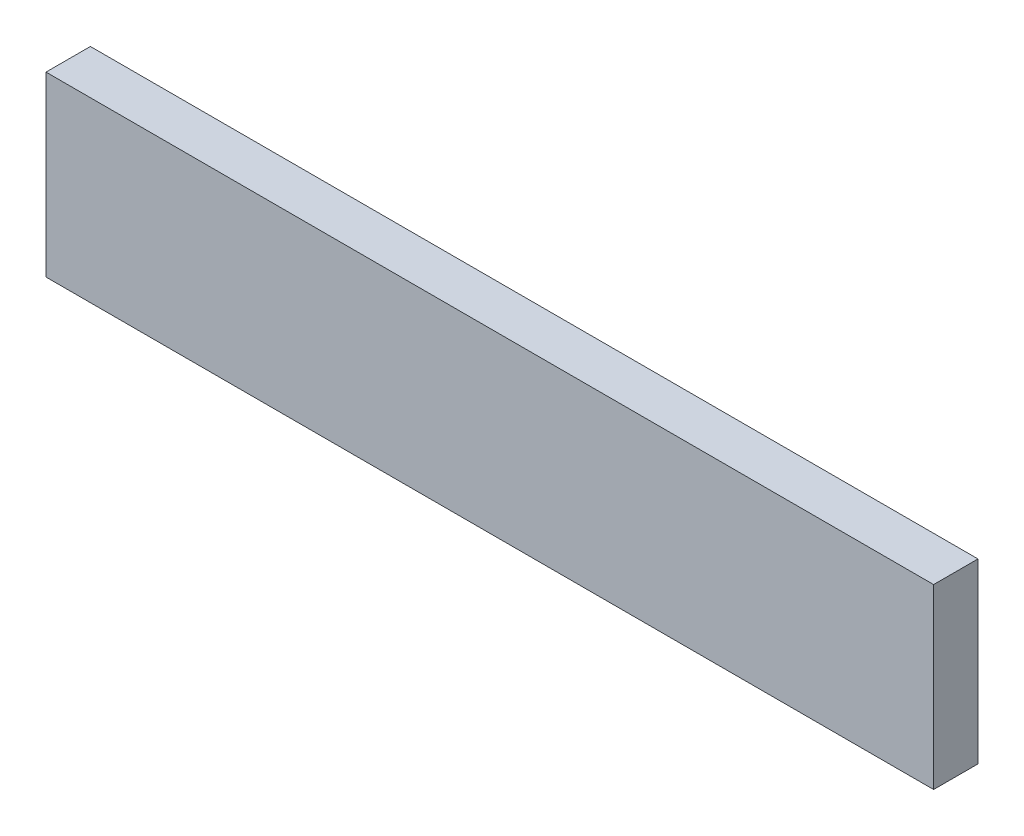
ISO-10303-21;
HEADER;
FILE_DESCRIPTION(('STEP AP214'),'2;1');
FILE_NAME('part.step','',(''),(''),'','','');
FILE_SCHEMA(('AUTOMOTIVE_DESIGN { 1 0 10303 214 1 1 1 1 }'));
ENDSEC;
DATA;
#1=APPLICATION_CONTEXT('core data for automotive mechanical design processes');
#2=APPLICATION_PROTOCOL_DEFINITION('international standard','automotive_design',2000,#1);
#3=PRODUCT_CONTEXT('',#1,'mechanical');
#4=PRODUCT('Part','Part','',(#3));
#5=PRODUCT_RELATED_PRODUCT_CATEGORY('part','',(#4));
#6=PRODUCT_DEFINITION_FORMATION('','',#4);
#7=PRODUCT_DEFINITION_CONTEXT('part definition',#1,'design');
#8=PRODUCT_DEFINITION('design','',#6,#7);
#9=PRODUCT_DEFINITION_SHAPE('','',#8);
#10=(LENGTH_UNIT() NAMED_UNIT(*) SI_UNIT(.MILLI.,.METRE.));
#11=(NAMED_UNIT(*) PLANE_ANGLE_UNIT() SI_UNIT($,.RADIAN.));
#12=(NAMED_UNIT(*) SI_UNIT($,.STERADIAN.) SOLID_ANGLE_UNIT());
#13=UNCERTAINTY_MEASURE_WITH_UNIT(LENGTH_MEASURE(1.E-05),#10,'distance_accuracy_value','');
#14=(GEOMETRIC_REPRESENTATION_CONTEXT(3) GLOBAL_UNCERTAINTY_ASSIGNED_CONTEXT((#13)) GLOBAL_UNIT_ASSIGNED_CONTEXT((#10,
#11,#12)) REPRESENTATION_CONTEXT('',''));
#15=CARTESIAN_POINT('',(0.,0.,0.));
#16=DIRECTION('',(0.,0.,1.));
#17=DIRECTION('',(1.,0.,0.));
#18=AXIS2_PLACEMENT_3D('',#15,#16,#17);
#19=CARTESIAN_POINT('',(-452.165297687559,185.387673956262,50.));
#20=DIRECTION('',(1.,0.,0.));
#21=DIRECTION('',(0.,1.,0.));
#22=AXIS2_PLACEMENT_3D('',#19,#20,#21);
#23=PLANE('',#22);
#24=DIRECTION('',(0.,-1.,0.));
#25=VECTOR('',#24,1.);
#26=CARTESIAN_POINT('',(-452.165297687559,185.387673956262,0.));
#27=LINE('',#26,#25);
#28=CARTESIAN_POINT('',(-452.165297687559,185.387673956262,0.));
#29=VERTEX_POINT('',#28);
#30=CARTESIAN_POINT('',(-452.165297687559,-14.6123260437376,0.));
#31=VERTEX_POINT('',#30);
#32=EDGE_CURVE('E101',#29,#31,#27,.T.);
#33=ORIENTED_EDGE('',*,*,#32,.T.);
#34=DIRECTION('',(0.,0.,-1.));
#35=VECTOR('',#34,1.);
#36=CARTESIAN_POINT('',(-452.165297687559,-14.6123260437376,50.));
#37=LINE('',#36,#35);
#38=CARTESIAN_POINT('',(-452.165297687559,-14.6123260437376,50.));
#39=VERTEX_POINT('',#38);
#40=EDGE_CURVE('E11',#39,#31,#37,.T.);
#41=ORIENTED_EDGE('',*,*,#40,.F.);
#42=DIRECTION('',(0.,-1.,0.));
#43=VECTOR('',#42,1.);
#44=CARTESIAN_POINT('',(-452.165297687559,185.387673956262,50.));
#45=LINE('',#44,#43);
#46=CARTESIAN_POINT('',(-452.165297687559,185.387673956262,50.));
#47=VERTEX_POINT('',#46);
#48=EDGE_CURVE('E89',#47,#39,#45,.T.);
#49=ORIENTED_EDGE('',*,*,#48,.F.);
#50=DIRECTION('',(0.,0.,-1.));
#51=VECTOR('',#50,1.);
#52=CARTESIAN_POINT('',(-452.165297687559,185.387673956262,50.));
#53=LINE('',#52,#51);
#54=EDGE_CURVE('E97',#47,#29,#53,.T.);
#55=ORIENTED_EDGE('',*,*,#54,.T.);
#56=EDGE_LOOP('',(#33,#41,#49,#55));
#57=FACE_BOUND('',#56,.T.);
#58=ADVANCED_FACE('F38',(#57),#23,.F.);
#59=CARTESIAN_POINT('',(-452.165297687559,-14.6123260437376,50.));
#60=DIRECTION('',(0.,1.,0.));
#61=DIRECTION('',(0.,0.,1.));
#62=AXIS2_PLACEMENT_3D('',#59,#60,#61);
#63=PLANE('',#62);
#64=DIRECTION('',(1.,0.,0.));
#65=VECTOR('',#64,1.);
#66=CARTESIAN_POINT('',(-452.165297687559,-14.6123260437376,0.));
#67=LINE('',#66,#65);
#68=CARTESIAN_POINT('',(547.834702312441,-14.6123260437376,0.));
#69=VERTEX_POINT('',#68);
#70=EDGE_CURVE('E93',#31,#69,#67,.T.);
#71=ORIENTED_EDGE('',*,*,#70,.T.);
#72=DIRECTION('',(0.,0.,-1.));
#73=VECTOR('',#72,1.);
#74=CARTESIAN_POINT('',(547.834702312441,-14.6123260437376,50.));
#75=LINE('',#74,#73);
#76=CARTESIAN_POINT('',(547.834702312441,-14.6123260437376,50.));
#77=VERTEX_POINT('',#76);
#78=EDGE_CURVE('E46',#77,#69,#75,.T.);
#79=ORIENTED_EDGE('',*,*,#78,.F.);
#80=DIRECTION('',(1.,0.,0.));
#81=VECTOR('',#80,1.);
#82=CARTESIAN_POINT('',(-452.165297687559,-14.6123260437376,50.));
#83=LINE('',#82,#81);
#84=EDGE_CURVE('E84',#39,#77,#83,.T.);
#85=ORIENTED_EDGE('',*,*,#84,.F.);
#86=ORIENTED_EDGE('',*,*,#40,.T.);
#87=EDGE_LOOP('',(#71,#79,#85,#86));
#88=FACE_BOUND('',#87,.T.);
#89=ADVANCED_FACE('F92',(#88),#63,.F.);
#90=CARTESIAN_POINT('',(547.834702312441,185.387673956262,50.));
#91=DIRECTION('',(-1.,0.,0.));
#92=DIRECTION('',(0.,0.,1.));
#93=AXIS2_PLACEMENT_3D('',#90,#91,#92);
#94=PLANE('',#93);
#95=DIRECTION('',(0.,1.,0.));
#96=VECTOR('',#95,1.);
#97=CARTESIAN_POINT('',(547.834702312441,185.387673956262,0.));
#98=LINE('',#97,#96);
#99=CARTESIAN_POINT('',(547.834702312441,185.387673956262,0.));
#100=VERTEX_POINT('',#99);
#101=EDGE_CURVE('E71',#69,#100,#98,.T.);
#102=ORIENTED_EDGE('',*,*,#101,.T.);
#103=DIRECTION('',(0.,0.,-1.));
#104=VECTOR('',#103,1.);
#105=CARTESIAN_POINT('',(547.834702312441,185.387673956262,50.));
#106=LINE('',#105,#104);
#107=CARTESIAN_POINT('',(547.834702312441,185.387673956262,50.));
#108=VERTEX_POINT('',#107);
#109=EDGE_CURVE('E94',#108,#100,#106,.T.);
#110=ORIENTED_EDGE('',*,*,#109,.F.);
#111=DIRECTION('',(0.,1.,0.));
#112=VECTOR('',#111,1.);
#113=CARTESIAN_POINT('',(547.834702312441,185.387673956262,50.));
#114=LINE('',#113,#112);
#115=EDGE_CURVE('E87',#77,#108,#114,.T.);
#116=ORIENTED_EDGE('',*,*,#115,.F.);
#117=ORIENTED_EDGE('',*,*,#78,.T.);
#118=EDGE_LOOP('',(#102,#110,#116,#117));
#119=FACE_BOUND('',#118,.T.);
#120=ADVANCED_FACE('F95',(#119),#94,.F.);
#121=CARTESIAN_POINT('',(-452.165297687559,185.387673956262,50.));
#122=DIRECTION('',(0.,-1.,0.));
#123=DIRECTION('',(0.,0.,-1.));
#124=AXIS2_PLACEMENT_3D('',#121,#122,#123);
#125=PLANE('',#124);
#126=DIRECTION('',(-1.,0.,0.));
#127=VECTOR('',#126,1.);
#128=CARTESIAN_POINT('',(-452.165297687559,185.387673956262,0.));
#129=LINE('',#128,#127);
#130=EDGE_CURVE('E77',#100,#29,#129,.T.);
#131=ORIENTED_EDGE('',*,*,#130,.T.);
#132=ORIENTED_EDGE('',*,*,#54,.F.);
#133=DIRECTION('',(-1.,0.,0.));
#134=VECTOR('',#133,1.);
#135=CARTESIAN_POINT('',(-452.165297687559,185.387673956262,50.));
#136=LINE('',#135,#134);
#137=EDGE_CURVE('E54',#108,#47,#136,.T.);
#138=ORIENTED_EDGE('',*,*,#137,.F.);
#139=ORIENTED_EDGE('',*,*,#109,.T.);
#140=EDGE_LOOP('',(#131,#132,#138,#139));
#141=FACE_BOUND('',#140,.T.);
#142=ADVANCED_FACE('F108',(#141),#125,.F.);
#143=CARTESIAN_POINT('',(0.,0.,50.));
#144=DIRECTION('',(0.,0.,1.));
#145=DIRECTION('',(1.,0.,0.));
#146=AXIS2_PLACEMENT_3D('',#143,#144,#145);
#147=PLANE('',#146);
#148=ORIENTED_EDGE('',*,*,#48,.T.);
#149=ORIENTED_EDGE('',*,*,#84,.T.);
#150=ORIENTED_EDGE('',*,*,#115,.T.);
#151=ORIENTED_EDGE('',*,*,#137,.T.);
#152=EDGE_LOOP('',(#148,#149,#150,#151));
#153=FACE_BOUND('',#152,.T.);
#154=ADVANCED_FACE('F85',(#153),#147,.T.);
#155=CARTESIAN_POINT('',(0.,0.,0.));
#156=DIRECTION('',(0.,0.,1.));
#157=DIRECTION('',(1.,0.,0.));
#158=AXIS2_PLACEMENT_3D('',#155,#156,#157);
#159=PLANE('',#158);
#160=ORIENTED_EDGE('',*,*,#32,.F.);
#161=ORIENTED_EDGE('',*,*,#130,.F.);
#162=ORIENTED_EDGE('',*,*,#101,.F.);
#163=ORIENTED_EDGE('',*,*,#70,.F.);
#164=EDGE_LOOP('',(#160,#161,#162,#163));
#165=FACE_BOUND('',#164,.T.);
#166=ADVANCED_FACE('F111',(#165),#159,.F.);
#167=CLOSED_SHELL('',(#58,#89,#120,#142,#154,#166));
#168=MANIFOLD_SOLID_BREP('B2',#167);
#169=ADVANCED_BREP_SHAPE_REPRESENTATION('',(#18,#168),#14);
#170=SHAPE_DEFINITION_REPRESENTATION(#9,#169);
ENDSEC;
END-ISO-10303-21;
